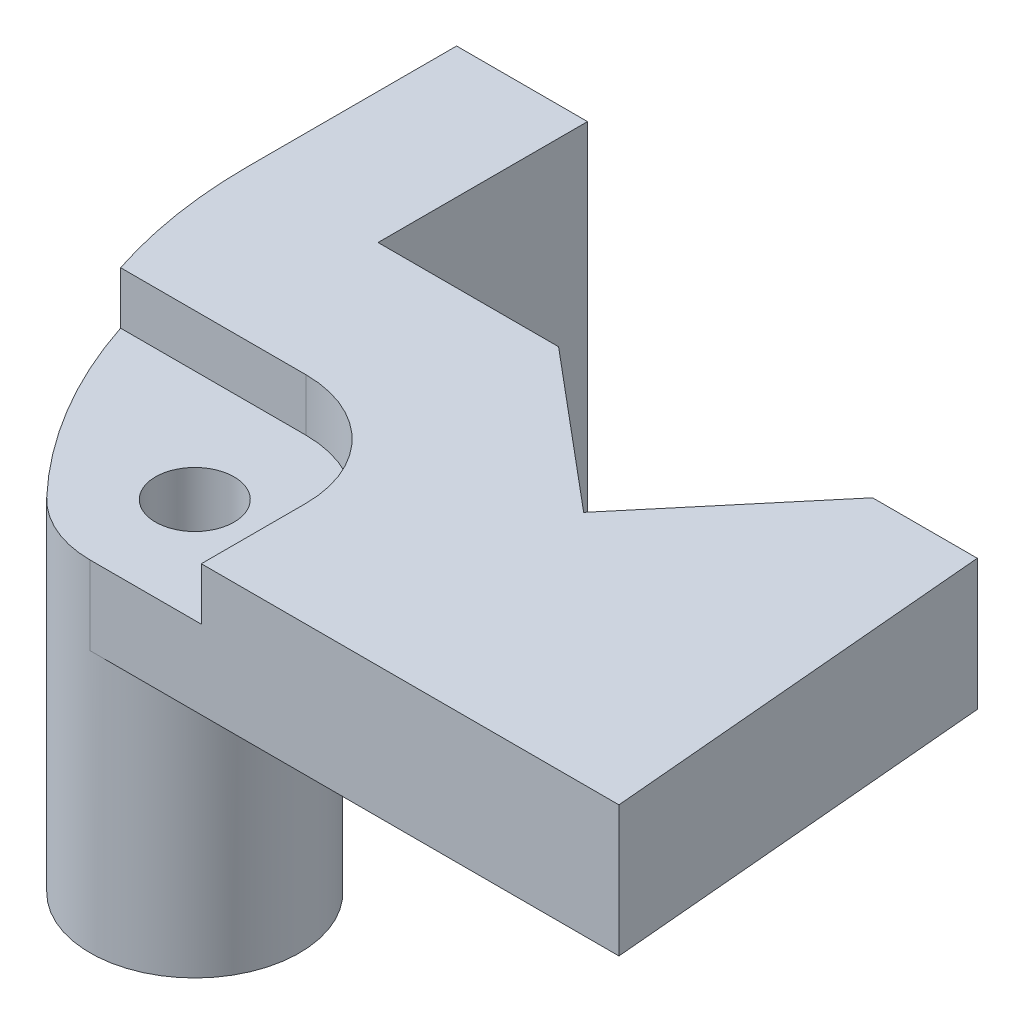
ISO-10303-21;
HEADER;
FILE_DESCRIPTION(('STEP AP214'),'2;1');
FILE_NAME('part.step','',(''),(''),'','','');
FILE_SCHEMA(('AUTOMOTIVE_DESIGN { 1 0 10303 214 1 1 1 1 }'));
ENDSEC;
DATA;
#1=APPLICATION_CONTEXT('core data for automotive mechanical design processes');
#2=APPLICATION_PROTOCOL_DEFINITION('international standard','automotive_design',2000,#1);
#3=PRODUCT_CONTEXT('',#1,'mechanical');
#4=PRODUCT('Part','Part','',(#3));
#5=PRODUCT_RELATED_PRODUCT_CATEGORY('part','',(#4));
#6=PRODUCT_DEFINITION_FORMATION('','',#4);
#7=PRODUCT_DEFINITION_CONTEXT('part definition',#1,'design');
#8=PRODUCT_DEFINITION('design','',#6,#7);
#9=PRODUCT_DEFINITION_SHAPE('','',#8);
#10=(LENGTH_UNIT() NAMED_UNIT(*) SI_UNIT(.MILLI.,.METRE.));
#11=(NAMED_UNIT(*) PLANE_ANGLE_UNIT() SI_UNIT($,.RADIAN.));
#12=(NAMED_UNIT(*) SI_UNIT($,.STERADIAN.) SOLID_ANGLE_UNIT());
#13=UNCERTAINTY_MEASURE_WITH_UNIT(LENGTH_MEASURE(1.E-05),#10,'distance_accuracy_value','');
#14=(GEOMETRIC_REPRESENTATION_CONTEXT(3) GLOBAL_UNCERTAINTY_ASSIGNED_CONTEXT((#13)) GLOBAL_UNIT_ASSIGNED_CONTEXT((#10,
#11,#12)) REPRESENTATION_CONTEXT('',''));
#15=CARTESIAN_POINT('',(0.,0.,0.));
#16=DIRECTION('',(0.,0.,1.));
#17=DIRECTION('',(1.,0.,0.));
#18=AXIS2_PLACEMENT_3D('',#15,#16,#17);
#19=CARTESIAN_POINT('',(7.50000000000006,5.,-14.));
#20=DIRECTION('',(0.,-1.,0.));
#21=DIRECTION('',(0.,0.,-1.));
#22=AXIS2_PLACEMENT_3D('',#19,#20,#21);
#23=CYLINDRICAL_SURFACE('',#22,18.5);
#24=CARTESIAN_POINT('',(7.50000000000006,-8.,-14.));
#25=DIRECTION('',(0.,-1.,0.));
#26=DIRECTION('',(0.,0.,-1.));
#27=AXIS2_PLACEMENT_3D('',#24,#25,#26);
#28=CIRCLE('',#27,18.5);
#29=CARTESIAN_POINT('',(-5.89655172413793,-8.,-1.24137931034483));
#30=VERTEX_POINT('',#29);
#31=CARTESIAN_POINT('',(-11.,-8.,-14.));
#32=VERTEX_POINT('',#31);
#33=EDGE_CURVE('E153',#30,#32,#28,.T.);
#34=ORIENTED_EDGE('',*,*,#33,.F.);
#35=DIRECTION('',(0.,-1.,0.));
#36=VECTOR('',#35,1.);
#37=CARTESIAN_POINT('',(-5.89655172413793,5.,-1.24137931034483));
#38=LINE('',#37,#36);
#39=CARTESIAN_POINT('',(-5.89655172413793,3.,-1.24137931034483));
#40=VERTEX_POINT('',#39);
#41=EDGE_CURVE('E163',#40,#30,#38,.T.);
#42=ORIENTED_EDGE('',*,*,#41,.F.);
#43=CARTESIAN_POINT('',(7.50000000000006,3.,-14.));
#44=DIRECTION('',(0.,-1.,0.));
#45=DIRECTION('',(0.,0.,-1.));
#46=AXIS2_PLACEMENT_3D('',#43,#44,#45);
#47=CIRCLE('',#46,18.5);
#48=CARTESIAN_POINT('',(-10.0837282736057,3.,-8.25));
#49=VERTEX_POINT('',#48);
#50=EDGE_CURVE('E294',#40,#49,#47,.T.);
#51=ORIENTED_EDGE('',*,*,#50,.T.);
#52=DIRECTION('',(0.,1.,0.));
#53=VECTOR('',#52,1.);
#54=CARTESIAN_POINT('',(-10.0837282736057,3.,-8.25));
#55=LINE('',#54,#53);
#56=CARTESIAN_POINT('',(-10.0837282736057,5.,-8.25));
#57=VERTEX_POINT('',#56);
#58=EDGE_CURVE('E289',#49,#57,#55,.T.);
#59=ORIENTED_EDGE('',*,*,#58,.T.);
#60=CARTESIAN_POINT('',(7.50000000000006,5.,-14.));
#61=DIRECTION('',(0.,1.,0.));
#62=DIRECTION('',(0.,0.,1.));
#63=AXIS2_PLACEMENT_3D('',#60,#61,#62);
#64=CIRCLE('',#63,18.5);
#65=CARTESIAN_POINT('',(-11.,5.,-14.));
#66=VERTEX_POINT('',#65);
#67=EDGE_CURVE('E206',#66,#57,#64,.T.);
#68=ORIENTED_EDGE('',*,*,#67,.F.);
#69=DIRECTION('',(0.,-1.,0.));
#70=VECTOR('',#69,1.);
#71=CARTESIAN_POINT('',(-11.,5.,-14.));
#72=LINE('',#71,#70);
#73=EDGE_CURVE('E166',#66,#32,#72,.T.);
#74=ORIENTED_EDGE('',*,*,#73,.T.);
#75=EDGE_LOOP('',(#34,#42,#51,#59,#68,#74));
#76=FACE_BOUND('',#75,.T.);
#77=ADVANCED_FACE('F34',(#76),#23,.T.);
#78=CARTESIAN_POINT('',(-5.99999999999999,5.,-22.));
#79=DIRECTION('',(-1.,0.,0.));
#80=DIRECTION('',(0.,0.,1.));
#81=AXIS2_PLACEMENT_3D('',#78,#79,#80);
#82=PLANE('',#81);
#83=DIRECTION('',(0.,0.,1.));
#84=VECTOR('',#83,1.);
#85=CARTESIAN_POINT('',(-5.99999999999999,-8.,-22.));
#86=LINE('',#85,#84);
#87=CARTESIAN_POINT('',(-5.99999999999999,-8.,-22.));
#88=VERTEX_POINT('',#87);
#89=CARTESIAN_POINT('',(-5.99999999999998,-8.,-8.));
#90=VERTEX_POINT('',#89);
#91=EDGE_CURVE('E157',#88,#90,#86,.T.);
#92=ORIENTED_EDGE('',*,*,#91,.F.);
#93=DIRECTION('',(0.,-1.,0.));
#94=VECTOR('',#93,1.);
#95=CARTESIAN_POINT('',(-5.99999999999999,5.,-22.));
#96=LINE('',#95,#94);
#97=CARTESIAN_POINT('',(-5.99999999999999,5.,-22.));
#98=VERTEX_POINT('',#97);
#99=EDGE_CURVE('E182',#98,#88,#96,.T.);
#100=ORIENTED_EDGE('',*,*,#99,.F.);
#101=DIRECTION('',(0.,0.,-1.));
#102=VECTOR('',#101,1.);
#103=CARTESIAN_POINT('',(-5.99999999999999,5.,-22.));
#104=LINE('',#103,#102);
#105=CARTESIAN_POINT('',(-5.99999999999999,5.,-14.));
#106=VERTEX_POINT('',#105);
#107=EDGE_CURVE('E198',#106,#98,#104,.T.);
#108=ORIENTED_EDGE('',*,*,#107,.F.);
#109=DIRECTION('',(0.,-1.,0.));
#110=VECTOR('',#109,1.);
#111=CARTESIAN_POINT('',(-5.99999999999999,5.,-14.));
#112=LINE('',#111,#110);
#113=CARTESIAN_POINT('',(-5.99999999999999,0.,-14.));
#114=VERTEX_POINT('',#113);
#115=EDGE_CURVE('E221',#106,#114,#112,.T.);
#116=ORIENTED_EDGE('',*,*,#115,.T.);
#117=DIRECTION('',(0.,0.,1.));
#118=VECTOR('',#117,1.);
#119=CARTESIAN_POINT('',(-5.99999999999999,0.,-22.));
#120=LINE('',#119,#118);
#121=CARTESIAN_POINT('',(-5.99999999999998,0.,-8.));
#122=VERTEX_POINT('',#121);
#123=EDGE_CURVE('E42',#114,#122,#120,.T.);
#124=ORIENTED_EDGE('',*,*,#123,.T.);
#125=DIRECTION('',(0.,1.,0.));
#126=VECTOR('',#125,1.);
#127=CARTESIAN_POINT('',(-5.99999999999998,-10.,-8.));
#128=LINE('',#127,#126);
#129=EDGE_CURVE('E196',#90,#122,#128,.T.);
#130=ORIENTED_EDGE('',*,*,#129,.F.);
#131=EDGE_LOOP('',(#92,#100,#108,#116,#124,#130));
#132=FACE_BOUND('',#131,.T.);
#133=ADVANCED_FACE('F36',(#132),#82,.F.);
#134=CARTESIAN_POINT('',(-11.,5.,-22.));
#135=DIRECTION('',(0.,0.,1.));
#136=DIRECTION('',(1.,0.,0.));
#137=AXIS2_PLACEMENT_3D('',#134,#135,#136);
#138=PLANE('',#137);
#139=DIRECTION('',(1.,0.,0.));
#140=VECTOR('',#139,1.);
#141=CARTESIAN_POINT('',(-11.,-8.,-22.));
#142=LINE('',#141,#140);
#143=CARTESIAN_POINT('',(-11.,-8.,-22.));
#144=VERTEX_POINT('',#143);
#145=EDGE_CURVE('E358',#144,#88,#142,.T.);
#146=ORIENTED_EDGE('',*,*,#145,.F.);
#147=DIRECTION('',(0.,-1.,0.));
#148=VECTOR('',#147,1.);
#149=CARTESIAN_POINT('',(-11.,5.,-22.));
#150=LINE('',#149,#148);
#151=CARTESIAN_POINT('',(-11.,5.,-22.));
#152=VERTEX_POINT('',#151);
#153=EDGE_CURVE('E174',#152,#144,#150,.T.);
#154=ORIENTED_EDGE('',*,*,#153,.F.);
#155=DIRECTION('',(-1.,0.,0.));
#156=VECTOR('',#155,1.);
#157=CARTESIAN_POINT('',(-11.,5.,-22.));
#158=LINE('',#157,#156);
#159=EDGE_CURVE('E201',#98,#152,#158,.T.);
#160=ORIENTED_EDGE('',*,*,#159,.F.);
#161=ORIENTED_EDGE('',*,*,#99,.T.);
#162=EDGE_LOOP('',(#146,#154,#160,#161));
#163=FACE_BOUND('',#162,.T.);
#164=ADVANCED_FACE('F347',(#163),#138,.F.);
#165=CARTESIAN_POINT('',(-11.,5.,-14.));
#166=DIRECTION('',(1.,0.,0.));
#167=DIRECTION('',(0.,0.,-1.));
#168=AXIS2_PLACEMENT_3D('',#165,#166,#167);
#169=PLANE('',#168);
#170=DIRECTION('',(0.,0.,-1.));
#171=VECTOR('',#170,1.);
#172=CARTESIAN_POINT('',(-11.,-8.,-14.));
#173=LINE('',#172,#171);
#174=EDGE_CURVE('E168',#32,#144,#173,.T.);
#175=ORIENTED_EDGE('',*,*,#174,.F.);
#176=ORIENTED_EDGE('',*,*,#73,.F.);
#177=DIRECTION('',(0.,0.,1.));
#178=VECTOR('',#177,1.);
#179=CARTESIAN_POINT('',(-11.,5.,-14.));
#180=LINE('',#179,#178);
#181=EDGE_CURVE('E204',#152,#66,#180,.T.);
#182=ORIENTED_EDGE('',*,*,#181,.F.);
#183=ORIENTED_EDGE('',*,*,#153,.T.);
#184=EDGE_LOOP('',(#175,#176,#182,#183));
#185=FACE_BOUND('',#184,.T.);
#186=ADVANCED_FACE('F329',(#185),#169,.F.);
#187=CARTESIAN_POINT('',(-2.99999999999999,-10.,-4.00000000000001));
#188=DIRECTION('',(0.,-1.,0.));
#189=DIRECTION('',(0.,0.,-1.));
#190=AXIS2_PLACEMENT_3D('',#187,#188,#189);
#191=PLANE('',#190);
#192=CARTESIAN_POINT('',(-2.99999999999999,-10.,-4.));
#193=DIRECTION('',(0.,-1.,0.));
#194=DIRECTION('',(0.,0.,-1.));
#195=AXIS2_PLACEMENT_3D('',#192,#193,#194);
#196=CIRCLE('',#195,1.5);
#197=CARTESIAN_POINT('',(-2.99999999999999,-10.,-5.5));
#198=VERTEX_POINT('',#197);
#199=EDGE_CURVE('E296',#198,#198,#196,.T.);
#200=ORIENTED_EDGE('',*,*,#199,.F.);
#201=EDGE_LOOP('',(#200));
#202=FACE_BOUND('',#201,.T.);
#203=CARTESIAN_POINT('',(-2.99999999999999,-10.,-4.00000000000001));
#204=DIRECTION('',(0.,-1.,0.));
#205=DIRECTION('',(0.,0.,-1.));
#206=AXIS2_PLACEMENT_3D('',#203,#204,#205);
#207=CIRCLE('',#206,4.00000000000001);
#208=CARTESIAN_POINT('',(-2.99999999999999,-10.,-8.00000000000002));
#209=VERTEX_POINT('',#208);
#210=EDGE_CURVE('E194',#209,#209,#207,.T.);
#211=ORIENTED_EDGE('',*,*,#210,.T.);
#212=EDGE_LOOP('',(#211));
#213=FACE_BOUND('',#212,.T.);
#214=ADVANCED_FACE('F325',(#202,#213),#191,.T.);
#215=CARTESIAN_POINT('',(-5.99999999999998,-10.,-8.));
#216=DIRECTION('',(0.,0.,1.));
#217=DIRECTION('',(1.,0.,0.));
#218=AXIS2_PLACEMENT_3D('',#215,#216,#217);
#219=PLANE('',#218);
#220=DIRECTION('',(1.,0.,0.));
#221=VECTOR('',#220,1.);
#222=CARTESIAN_POINT('',(-5.99999999999998,-8.,-8.));
#223=LINE('',#222,#221);
#224=CARTESIAN_POINT('',(-2.99999999999998,-8.,-8.));
#225=VERTEX_POINT('',#224);
#226=EDGE_CURVE('E12',#90,#225,#223,.T.);
#227=ORIENTED_EDGE('',*,*,#226,.F.);
#228=ORIENTED_EDGE('',*,*,#129,.T.);
#229=DIRECTION('',(1.,0.,0.));
#230=VECTOR('',#229,1.);
#231=CARTESIAN_POINT('',(-5.99999999999998,0.,-8.));
#232=LINE('',#231,#230);
#233=CARTESIAN_POINT('',(-2.99999999999998,0.,-8.));
#234=VERTEX_POINT('',#233);
#235=EDGE_CURVE('E195',#122,#234,#232,.T.);
#236=ORIENTED_EDGE('',*,*,#235,.T.);
#237=DIRECTION('',(0.,1.,0.));
#238=VECTOR('',#237,1.);
#239=CARTESIAN_POINT('',(-2.99999999999998,-10.,-8.));
#240=LINE('',#239,#238);
#241=EDGE_CURVE('E301',#225,#234,#240,.T.);
#242=ORIENTED_EDGE('',*,*,#241,.F.);
#243=EDGE_LOOP('',(#227,#228,#236,#242));
#244=FACE_BOUND('',#243,.T.);
#245=ADVANCED_FACE('F328',(#244),#219,.F.);
#246=CARTESIAN_POINT('',(-3.,5.,-4.));
#247=DIRECTION('',(0.,-1.,0.));
#248=DIRECTION('',(0.,0.,-1.));
#249=AXIS2_PLACEMENT_3D('',#246,#247,#248);
#250=PLANE('',#249);
#251=DIRECTION('',(1.,0.,0.));
#252=VECTOR('',#251,1.);
#253=CARTESIAN_POINT('',(-10.0837282736057,5.,-8.25));
#254=LINE('',#253,#252);
#255=CARTESIAN_POINT('',(-3.,5.,-8.25));
#256=VERTEX_POINT('',#255);
#257=EDGE_CURVE('E167',#57,#256,#254,.T.);
#258=ORIENTED_EDGE('',*,*,#257,.T.);
#259=CARTESIAN_POINT('',(-3.,5.,-4.));
#260=DIRECTION('',(0.,-1.,0.));
#261=DIRECTION('',(0.,0.,-1.));
#262=AXIS2_PLACEMENT_3D('',#259,#260,#261);
#263=CIRCLE('',#262,4.25);
#264=CARTESIAN_POINT('',(1.25,5.,-4.));
#265=VERTEX_POINT('',#264);
#266=EDGE_CURVE('E376',#256,#265,#263,.T.);
#267=ORIENTED_EDGE('',*,*,#266,.T.);
#268=DIRECTION('',(0.,0.,1.));
#269=VECTOR('',#268,1.);
#270=CARTESIAN_POINT('',(1.25,5.,-4.));
#271=LINE('',#270,#269);
#272=CARTESIAN_POINT('',(1.25000000000001,5.,0.));
#273=VERTEX_POINT('',#272);
#274=EDGE_CURVE('E273',#265,#273,#271,.T.);
#275=ORIENTED_EDGE('',*,*,#274,.T.);
#276=DIRECTION('',(1.,0.,0.));
#277=VECTOR('',#276,1.);
#278=CARTESIAN_POINT('',(-3.,5.,0.));
#279=LINE('',#278,#277);
#280=CARTESIAN_POINT('',(17.2,5.,0.));
#281=VERTEX_POINT('',#280);
#282=EDGE_CURVE('E209',#273,#281,#279,.T.);
#283=ORIENTED_EDGE('',*,*,#282,.T.);
#284=DIRECTION('',(-0.0871557427476618,0.,-0.996194698091745));
#285=VECTOR('',#284,1.);
#286=CARTESIAN_POINT('',(17.2,5.,0.));
#287=LINE('',#286,#285);
#288=CARTESIAN_POINT('',(15.8876700471111,5.,-15.));
#289=VERTEX_POINT('',#288);
#290=EDGE_CURVE('E211',#281,#289,#287,.T.);
#291=ORIENTED_EDGE('',*,*,#290,.T.);
#292=DIRECTION('',(-1.,0.,0.));
#293=VECTOR('',#292,1.);
#294=CARTESIAN_POINT('',(11.8876700471111,5.,-15.));
#295=LINE('',#294,#293);
#296=CARTESIAN_POINT('',(11.8876700471111,5.,-15.));
#297=VERTEX_POINT('',#296);
#298=EDGE_CURVE('E213',#289,#297,#295,.T.);
#299=ORIENTED_EDGE('',*,*,#298,.T.);
#300=DIRECTION('',(-0.642787609686543,0.,0.766044443118975));
#301=VECTOR('',#300,1.);
#302=CARTESIAN_POINT('',(11.8876700471111,5.,-15.));
#303=LINE('',#302,#301);
#304=CARTESIAN_POINT('',(6.85307226004736,5.,-9.));
#305=VERTEX_POINT('',#304);
#306=EDGE_CURVE('E215',#297,#305,#303,.T.);
#307=ORIENTED_EDGE('',*,*,#306,.T.);
#308=DIRECTION('',(-0.766044443118977,0.,-0.642787609686541));
#309=VECTOR('',#308,1.);
#310=CARTESIAN_POINT('',(0.894304297076328,5.,-14.));
#311=LINE('',#310,#309);
#312=CARTESIAN_POINT('',(0.894304297076328,5.,-14.));
#313=VERTEX_POINT('',#312);
#314=EDGE_CURVE('E217',#305,#313,#311,.T.);
#315=ORIENTED_EDGE('',*,*,#314,.T.);
#316=DIRECTION('',(-1.,0.,0.));
#317=VECTOR('',#316,1.);
#318=CARTESIAN_POINT('',(0.894304297076328,5.,-14.));
#319=LINE('',#318,#317);
#320=EDGE_CURVE('E219',#313,#106,#319,.T.);
#321=ORIENTED_EDGE('',*,*,#320,.T.);
#322=ORIENTED_EDGE('',*,*,#107,.T.);
#323=ORIENTED_EDGE('',*,*,#159,.T.);
#324=ORIENTED_EDGE('',*,*,#181,.T.);
#325=ORIENTED_EDGE('',*,*,#67,.T.);
#326=EDGE_LOOP('',(#258,#267,#275,#283,#291,#299,#307,#315,#321,#322,#323,#324,#325));
#327=FACE_BOUND('',#326,.T.);
#328=ADVANCED_FACE('F268',(#327),#250,.F.);
#329=CARTESIAN_POINT('',(-3.,5.,0.));
#330=DIRECTION('',(0.,0.,-1.));
#331=DIRECTION('',(-1.,0.,0.));
#332=AXIS2_PLACEMENT_3D('',#329,#330,#331);
#333=PLANE('',#332);
#334=DIRECTION('',(0.,1.,0.));
#335=VECTOR('',#334,1.);
#336=CARTESIAN_POINT('',(1.25000000000001,3.,0.));
#337=LINE('',#336,#335);
#338=CARTESIAN_POINT('',(1.25000000000001,3.,0.));
#339=VERTEX_POINT('',#338);
#340=EDGE_CURVE('E276',#339,#273,#337,.T.);
#341=ORIENTED_EDGE('',*,*,#340,.F.);
#342=DIRECTION('',(-1.,0.,0.));
#343=VECTOR('',#342,1.);
#344=CARTESIAN_POINT('',(1.25000000000001,3.,0.));
#345=LINE('',#344,#343);
#346=CARTESIAN_POINT('',(-3.,3.,0.));
#347=VERTEX_POINT('',#346);
#348=EDGE_CURVE('E277',#339,#347,#345,.T.);
#349=ORIENTED_EDGE('',*,*,#348,.T.);
#350=DIRECTION('',(0.,-1.,0.));
#351=VECTOR('',#350,1.);
#352=CARTESIAN_POINT('',(-3.,5.,0.));
#353=LINE('',#352,#351);
#354=CARTESIAN_POINT('',(-3.,0.,0.));
#355=VERTEX_POINT('',#354);
#356=EDGE_CURVE('E172',#347,#355,#353,.T.);
#357=ORIENTED_EDGE('',*,*,#356,.T.);
#358=DIRECTION('',(1.,0.,0.));
#359=VECTOR('',#358,1.);
#360=CARTESIAN_POINT('',(-3.,0.,0.));
#361=LINE('',#360,#359);
#362=CARTESIAN_POINT('',(17.2,0.,0.));
#363=VERTEX_POINT('',#362);
#364=EDGE_CURVE('E225',#355,#363,#361,.T.);
#365=ORIENTED_EDGE('',*,*,#364,.T.);
#366=DIRECTION('',(0.,-1.,0.));
#367=VECTOR('',#366,1.);
#368=CARTESIAN_POINT('',(17.2,5.,0.));
#369=LINE('',#368,#367);
#370=EDGE_CURVE('E176',#281,#363,#369,.T.);
#371=ORIENTED_EDGE('',*,*,#370,.F.);
#372=ORIENTED_EDGE('',*,*,#282,.F.);
#373=EDGE_LOOP('',(#341,#349,#357,#365,#371,#372));
#374=FACE_BOUND('',#373,.T.);
#375=ADVANCED_FACE('F275',(#374),#333,.F.);
#376=CARTESIAN_POINT('',(-3.,0.,-4.));
#377=DIRECTION('',(0.,-1.,0.));
#378=DIRECTION('',(0.,0.,-1.));
#379=AXIS2_PLACEMENT_3D('',#376,#377,#378);
#380=PLANE('',#379);
#381=CARTESIAN_POINT('',(-2.99999999999999,0.,-4.));
#382=DIRECTION('',(0.,-1.,0.));
#383=DIRECTION('',(0.,0.,1.));
#384=AXIS2_PLACEMENT_3D('',#381,#382,#383);
#385=CIRCLE('',#384,4.);
#386=EDGE_CURVE('E190',#234,#355,#385,.T.);
#387=ORIENTED_EDGE('',*,*,#386,.F.);
#388=ORIENTED_EDGE('',*,*,#235,.F.);
#389=ORIENTED_EDGE('',*,*,#123,.F.);
#390=DIRECTION('',(-1.,0.,0.));
#391=VECTOR('',#390,1.);
#392=CARTESIAN_POINT('',(0.894304297076328,0.,-14.));
#393=LINE('',#392,#391);
#394=CARTESIAN_POINT('',(0.894304297076328,0.,-14.));
#395=VERTEX_POINT('',#394);
#396=EDGE_CURVE('E202',#395,#114,#393,.T.);
#397=ORIENTED_EDGE('',*,*,#396,.F.);
#398=DIRECTION('',(-0.766044443118977,0.,-0.642787609686541));
#399=VECTOR('',#398,1.);
#400=CARTESIAN_POINT('',(0.894304297076328,0.,-14.));
#401=LINE('',#400,#399);
#402=CARTESIAN_POINT('',(6.85307226004736,0.,-9.));
#403=VERTEX_POINT('',#402);
#404=EDGE_CURVE('E229',#403,#395,#401,.T.);
#405=ORIENTED_EDGE('',*,*,#404,.F.);
#406=DIRECTION('',(-0.642787609686543,0.,0.766044443118975));
#407=VECTOR('',#406,1.);
#408=CARTESIAN_POINT('',(11.8876700471111,0.,-15.));
#409=LINE('',#408,#407);
#410=CARTESIAN_POINT('',(11.8876700471111,0.,-15.));
#411=VERTEX_POINT('',#410);
#412=EDGE_CURVE('E227',#411,#403,#409,.T.);
#413=ORIENTED_EDGE('',*,*,#412,.F.);
#414=DIRECTION('',(-1.,0.,0.));
#415=VECTOR('',#414,1.);
#416=CARTESIAN_POINT('',(11.8876700471111,0.,-15.));
#417=LINE('',#416,#415);
#418=CARTESIAN_POINT('',(15.8876700471111,0.,-15.));
#419=VERTEX_POINT('',#418);
#420=EDGE_CURVE('E224',#419,#411,#417,.T.);
#421=ORIENTED_EDGE('',*,*,#420,.F.);
#422=DIRECTION('',(-0.0871557427476618,0.,-0.996194698091745));
#423=VECTOR('',#422,1.);
#424=CARTESIAN_POINT('',(17.2,0.,0.));
#425=LINE('',#424,#423);
#426=EDGE_CURVE('E222',#363,#419,#425,.T.);
#427=ORIENTED_EDGE('',*,*,#426,.F.);
#428=ORIENTED_EDGE('',*,*,#364,.F.);
#429=EDGE_LOOP('',(#387,#388,#389,#397,#405,#413,#421,#427,#428));
#430=FACE_BOUND('',#429,.T.);
#431=ADVANCED_FACE('F256',(#430),#380,.T.);
#432=CARTESIAN_POINT('',(-3.,5.,-4.));
#433=DIRECTION('',(0.,-1.,0.));
#434=DIRECTION('',(0.,0.,-1.));
#435=AXIS2_PLACEMENT_3D('',#432,#433,#434);
#436=CYLINDRICAL_SURFACE('',#435,4.);
#437=ORIENTED_EDGE('',*,*,#210,.F.);
#438=EDGE_LOOP('',(#437));
#439=FACE_BOUND('',#438,.T.);
#440=ORIENTED_EDGE('',*,*,#41,.T.);
#441=CARTESIAN_POINT('',(-2.99999999999999,-8.,-4.));
#442=DIRECTION('',(0.,-1.,0.));
#443=DIRECTION('',(0.,0.,-1.));
#444=AXIS2_PLACEMENT_3D('',#441,#442,#443);
#445=CIRCLE('',#444,4.);
#446=EDGE_CURVE('E49',#30,#225,#445,.T.);
#447=ORIENTED_EDGE('',*,*,#446,.T.);
#448=ORIENTED_EDGE('',*,*,#241,.T.);
#449=ORIENTED_EDGE('',*,*,#386,.T.);
#450=ORIENTED_EDGE('',*,*,#356,.F.);
#451=CARTESIAN_POINT('',(-3.,3.,-4.));
#452=DIRECTION('',(0.,-1.,0.));
#453=DIRECTION('',(0.,0.,-1.));
#454=AXIS2_PLACEMENT_3D('',#451,#452,#453);
#455=CIRCLE('',#454,4.);
#456=EDGE_CURVE('E56',#347,#40,#455,.T.);
#457=ORIENTED_EDGE('',*,*,#456,.T.);
#458=EDGE_LOOP('',(#440,#447,#448,#449,#450,#457));
#459=FACE_BOUND('',#458,.T.);
#460=ADVANCED_FACE('F170',(#439,#459),#436,.T.);
#461=CARTESIAN_POINT('',(17.2,5.,0.));
#462=DIRECTION('',(-0.996194698091745,0.,0.0871557427476618));
#463=DIRECTION('',(0.0871557427476618,0.,0.996194698091745));
#464=AXIS2_PLACEMENT_3D('',#461,#462,#463);
#465=PLANE('',#464);
#466=ORIENTED_EDGE('',*,*,#426,.T.);
#467=DIRECTION('',(0.,-1.,0.));
#468=VECTOR('',#467,1.);
#469=CARTESIAN_POINT('',(15.8876700471111,5.,-15.));
#470=LINE('',#469,#468);
#471=EDGE_CURVE('E239',#289,#419,#470,.T.);
#472=ORIENTED_EDGE('',*,*,#471,.F.);
#473=ORIENTED_EDGE('',*,*,#290,.F.);
#474=ORIENTED_EDGE('',*,*,#370,.T.);
#475=EDGE_LOOP('',(#466,#472,#473,#474));
#476=FACE_BOUND('',#475,.T.);
#477=ADVANCED_FACE('F250',(#476),#465,.F.);
#478=CARTESIAN_POINT('',(11.8876700471111,5.,-15.));
#479=DIRECTION('',(0.,0.,1.));
#480=DIRECTION('',(1.,0.,0.));
#481=AXIS2_PLACEMENT_3D('',#478,#479,#480);
#482=PLANE('',#481);
#483=ORIENTED_EDGE('',*,*,#420,.T.);
#484=DIRECTION('',(0.,-1.,0.));
#485=VECTOR('',#484,1.);
#486=CARTESIAN_POINT('',(11.8876700471111,5.,-15.));
#487=LINE('',#486,#485);
#488=EDGE_CURVE('E237',#297,#411,#487,.T.);
#489=ORIENTED_EDGE('',*,*,#488,.F.);
#490=ORIENTED_EDGE('',*,*,#298,.F.);
#491=ORIENTED_EDGE('',*,*,#471,.T.);
#492=EDGE_LOOP('',(#483,#489,#490,#491));
#493=FACE_BOUND('',#492,.T.);
#494=ADVANCED_FACE('F260',(#493),#482,.F.);
#495=CARTESIAN_POINT('',(11.8876700471111,5.,-15.));
#496=DIRECTION('',(0.766044443118975,0.,0.642787609686543));
#497=DIRECTION('',(0.642787609686543,0.,-0.766044443118975));
#498=AXIS2_PLACEMENT_3D('',#495,#496,#497);
#499=PLANE('',#498);
#500=ORIENTED_EDGE('',*,*,#412,.T.);
#501=DIRECTION('',(0.,-1.,0.));
#502=VECTOR('',#501,1.);
#503=CARTESIAN_POINT('',(6.85307226004736,5.,-9.));
#504=LINE('',#503,#502);
#505=EDGE_CURVE('E234',#305,#403,#504,.T.);
#506=ORIENTED_EDGE('',*,*,#505,.F.);
#507=ORIENTED_EDGE('',*,*,#306,.F.);
#508=ORIENTED_EDGE('',*,*,#488,.T.);
#509=EDGE_LOOP('',(#500,#506,#507,#508));
#510=FACE_BOUND('',#509,.T.);
#511=ADVANCED_FACE('F263',(#510),#499,.F.);
#512=CARTESIAN_POINT('',(0.894304297076328,5.,-14.));
#513=DIRECTION('',(-0.642787609686541,0.,0.766044443118977));
#514=DIRECTION('',(0.766044443118977,0.,0.642787609686541));
#515=AXIS2_PLACEMENT_3D('',#512,#513,#514);
#516=PLANE('',#515);
#517=ORIENTED_EDGE('',*,*,#404,.T.);
#518=DIRECTION('',(0.,-1.,0.));
#519=VECTOR('',#518,1.);
#520=CARTESIAN_POINT('',(0.894304297076328,5.,-14.));
#521=LINE('',#520,#519);
#522=EDGE_CURVE('E231',#313,#395,#521,.T.);
#523=ORIENTED_EDGE('',*,*,#522,.F.);
#524=ORIENTED_EDGE('',*,*,#314,.F.);
#525=ORIENTED_EDGE('',*,*,#505,.T.);
#526=EDGE_LOOP('',(#517,#523,#524,#525));
#527=FACE_BOUND('',#526,.T.);
#528=ADVANCED_FACE('F405',(#527),#516,.F.);
#529=CARTESIAN_POINT('',(0.894304297076328,5.,-14.));
#530=DIRECTION('',(0.,0.,1.));
#531=DIRECTION('',(1.,0.,0.));
#532=AXIS2_PLACEMENT_3D('',#529,#530,#531);
#533=PLANE('',#532);
#534=ORIENTED_EDGE('',*,*,#396,.T.);
#535=ORIENTED_EDGE('',*,*,#115,.F.);
#536=ORIENTED_EDGE('',*,*,#320,.F.);
#537=ORIENTED_EDGE('',*,*,#522,.T.);
#538=EDGE_LOOP('',(#534,#535,#536,#537));
#539=FACE_BOUND('',#538,.T.);
#540=ADVANCED_FACE('F321',(#539),#533,.F.);
#541=CARTESIAN_POINT('',(-3.,5.,-4.));
#542=DIRECTION('',(0.,-1.,0.));
#543=DIRECTION('',(0.,0.,-1.));
#544=AXIS2_PLACEMENT_3D('',#541,#542,#543);
#545=CYLINDRICAL_SURFACE('',#544,1.5);
#546=CARTESIAN_POINT('',(-3.,3.,-4.));
#547=DIRECTION('',(0.,-1.,0.));
#548=DIRECTION('',(0.,0.,-1.));
#549=AXIS2_PLACEMENT_3D('',#546,#547,#548);
#550=CIRCLE('',#549,1.5);
#551=CARTESIAN_POINT('',(-3.,3.,-5.5));
#552=VERTEX_POINT('',#551);
#553=EDGE_CURVE('E292',#552,#552,#550,.T.);
#554=ORIENTED_EDGE('',*,*,#553,.F.);
#555=EDGE_LOOP('',(#554));
#556=FACE_BOUND('',#555,.T.);
#557=ORIENTED_EDGE('',*,*,#199,.T.);
#558=EDGE_LOOP('',(#557));
#559=FACE_BOUND('',#558,.T.);
#560=ADVANCED_FACE('F318',(#556,#559),#545,.F.);
#561=CARTESIAN_POINT('',(-3.,3.,-4.));
#562=DIRECTION('',(0.,-1.,0.));
#563=DIRECTION('',(0.,0.,-1.));
#564=AXIS2_PLACEMENT_3D('',#561,#562,#563);
#565=PLANE('',#564);
#566=ORIENTED_EDGE('',*,*,#553,.T.);
#567=EDGE_LOOP('',(#566));
#568=FACE_BOUND('',#567,.T.);
#569=ORIENTED_EDGE('',*,*,#456,.F.);
#570=ORIENTED_EDGE('',*,*,#348,.F.);
#571=DIRECTION('',(0.,0.,1.));
#572=VECTOR('',#571,1.);
#573=CARTESIAN_POINT('',(1.25,3.,-4.));
#574=LINE('',#573,#572);
#575=CARTESIAN_POINT('',(1.25,3.,-4.));
#576=VERTEX_POINT('',#575);
#577=EDGE_CURVE('E283',#576,#339,#574,.T.);
#578=ORIENTED_EDGE('',*,*,#577,.F.);
#579=CARTESIAN_POINT('',(-3.,3.,-4.));
#580=DIRECTION('',(0.,-1.,0.));
#581=DIRECTION('',(0.,0.,-1.));
#582=AXIS2_PLACEMENT_3D('',#579,#580,#581);
#583=CIRCLE('',#582,4.25);
#584=CARTESIAN_POINT('',(-3.,3.,-8.25));
#585=VERTEX_POINT('',#584);
#586=EDGE_CURVE('E373',#585,#576,#583,.T.);
#587=ORIENTED_EDGE('',*,*,#586,.F.);
#588=DIRECTION('',(1.,0.,0.));
#589=VECTOR('',#588,1.);
#590=CARTESIAN_POINT('',(-10.0837282736057,3.,-8.25));
#591=LINE('',#590,#589);
#592=EDGE_CURVE('E371',#49,#585,#591,.T.);
#593=ORIENTED_EDGE('',*,*,#592,.F.);
#594=ORIENTED_EDGE('',*,*,#50,.F.);
#595=EDGE_LOOP('',(#569,#570,#578,#587,#593,#594));
#596=FACE_BOUND('',#595,.T.);
#597=ADVANCED_FACE('F316',(#568,#596),#565,.F.);
#598=CARTESIAN_POINT('',(-10.0837282736057,3.,-8.25));
#599=DIRECTION('',(0.,0.,1.));
#600=DIRECTION('',(1.,0.,0.));
#601=AXIS2_PLACEMENT_3D('',#598,#599,#600);
#602=PLANE('',#601);
#603=ORIENTED_EDGE('',*,*,#257,.F.);
#604=ORIENTED_EDGE('',*,*,#58,.F.);
#605=ORIENTED_EDGE('',*,*,#592,.T.);
#606=DIRECTION('',(0.,1.,0.));
#607=VECTOR('',#606,1.);
#608=CARTESIAN_POINT('',(-3.,3.,-8.25));
#609=LINE('',#608,#607);
#610=EDGE_CURVE('E281',#585,#256,#609,.T.);
#611=ORIENTED_EDGE('',*,*,#610,.T.);
#612=EDGE_LOOP('',(#603,#604,#605,#611));
#613=FACE_BOUND('',#612,.T.);
#614=ADVANCED_FACE('F392',(#613),#602,.T.);
#615=CARTESIAN_POINT('',(-3.,3.,-4.));
#616=DIRECTION('',(0.,1.,0.));
#617=DIRECTION('',(0.,0.,1.));
#618=AXIS2_PLACEMENT_3D('',#615,#616,#617);
#619=CYLINDRICAL_SURFACE('',#618,4.25);
#620=ORIENTED_EDGE('',*,*,#266,.F.);
#621=ORIENTED_EDGE('',*,*,#610,.F.);
#622=ORIENTED_EDGE('',*,*,#586,.T.);
#623=DIRECTION('',(0.,1.,0.));
#624=VECTOR('',#623,1.);
#625=CARTESIAN_POINT('',(1.25,3.,-4.));
#626=LINE('',#625,#624);
#627=EDGE_CURVE('E279',#576,#265,#626,.T.);
#628=ORIENTED_EDGE('',*,*,#627,.T.);
#629=EDGE_LOOP('',(#620,#621,#622,#628));
#630=FACE_BOUND('',#629,.T.);
#631=ADVANCED_FACE('F380',(#630),#619,.F.);
#632=CARTESIAN_POINT('',(1.25,3.,-4.));
#633=DIRECTION('',(-1.,0.,0.));
#634=DIRECTION('',(0.,0.,1.));
#635=AXIS2_PLACEMENT_3D('',#632,#633,#634);
#636=PLANE('',#635);
#637=ORIENTED_EDGE('',*,*,#274,.F.);
#638=ORIENTED_EDGE('',*,*,#627,.F.);
#639=ORIENTED_EDGE('',*,*,#577,.T.);
#640=ORIENTED_EDGE('',*,*,#340,.T.);
#641=EDGE_LOOP('',(#637,#638,#639,#640));
#642=FACE_BOUND('',#641,.T.);
#643=ADVANCED_FACE('F384',(#642),#636,.T.);
#644=CARTESIAN_POINT('',(3.10001250000001,-8.,-10.999975));
#645=DIRECTION('',(0.,-1.,0.));
#646=DIRECTION('',(0.,0.,-1.));
#647=AXIS2_PLACEMENT_3D('',#644,#645,#646);
#648=PLANE('',#647);
#649=ORIENTED_EDGE('',*,*,#33,.T.);
#650=ORIENTED_EDGE('',*,*,#174,.T.);
#651=ORIENTED_EDGE('',*,*,#145,.T.);
#652=ORIENTED_EDGE('',*,*,#91,.T.);
#653=ORIENTED_EDGE('',*,*,#226,.T.);
#654=ORIENTED_EDGE('',*,*,#446,.F.);
#655=EDGE_LOOP('',(#649,#650,#651,#652,#653,#654));
#656=FACE_BOUND('',#655,.T.);
#657=ADVANCED_FACE('F152',(#656),#648,.T.);
#658=CLOSED_SHELL('',(#77,#133,#164,#186,#214,#245,#328,#375,#431,#460,#477,#494,#511,#528,#540,
#560,#597,#614,#631,#643,#657));
#659=MANIFOLD_SOLID_BREP('B2',#658);
#660=ADVANCED_BREP_SHAPE_REPRESENTATION('',(#18,#659),#14);
#661=SHAPE_DEFINITION_REPRESENTATION(#9,#660);
ENDSEC;
END-ISO-10303-21;
